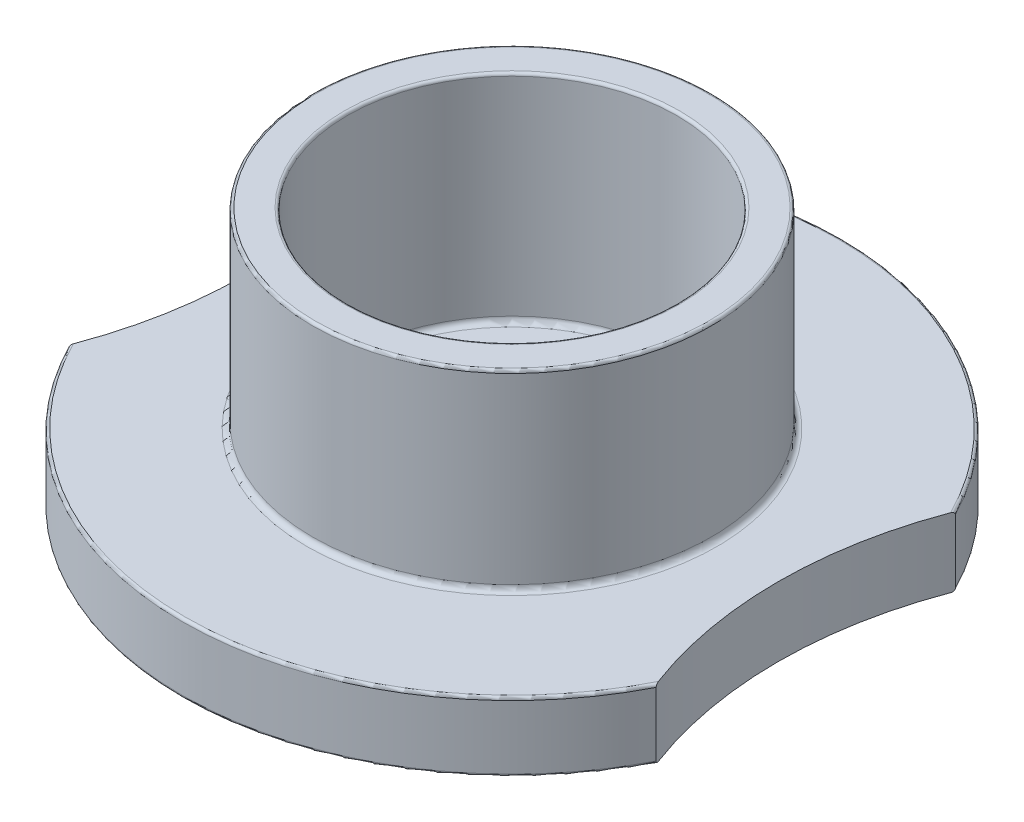
ISO-10303-21;
HEADER;
FILE_DESCRIPTION(('STEP AP214'),'2;1');
FILE_NAME('part.step','',(''),(''),'','','');
FILE_SCHEMA(('AUTOMOTIVE_DESIGN { 1 0 10303 214 1 1 1 1 }'));
ENDSEC;
DATA;
#1=APPLICATION_CONTEXT('core data for automotive mechanical design processes');
#2=APPLICATION_PROTOCOL_DEFINITION('international standard','automotive_design',2000,#1);
#3=PRODUCT_CONTEXT('',#1,'mechanical');
#4=PRODUCT('Part','Part','',(#3));
#5=PRODUCT_RELATED_PRODUCT_CATEGORY('part','',(#4));
#6=PRODUCT_DEFINITION_FORMATION('','',#4);
#7=PRODUCT_DEFINITION_CONTEXT('part definition',#1,'design');
#8=PRODUCT_DEFINITION('design','',#6,#7);
#9=PRODUCT_DEFINITION_SHAPE('','',#8);
#10=(LENGTH_UNIT() NAMED_UNIT(*) SI_UNIT(.MILLI.,.METRE.));
#11=(NAMED_UNIT(*) PLANE_ANGLE_UNIT() SI_UNIT($,.RADIAN.));
#12=(NAMED_UNIT(*) SI_UNIT($,.STERADIAN.) SOLID_ANGLE_UNIT());
#13=UNCERTAINTY_MEASURE_WITH_UNIT(LENGTH_MEASURE(1.E-05),#10,'distance_accuracy_value','');
#14=(GEOMETRIC_REPRESENTATION_CONTEXT(3) GLOBAL_UNCERTAINTY_ASSIGNED_CONTEXT((#13)) GLOBAL_UNIT_ASSIGNED_CONTEXT((#10,
#11,#12)) REPRESENTATION_CONTEXT('',''));
#15=CARTESIAN_POINT('',(0.,0.,0.));
#16=DIRECTION('',(0.,0.,1.));
#17=DIRECTION('',(1.,0.,0.));
#18=AXIS2_PLACEMENT_3D('',#15,#16,#17);
#19=CARTESIAN_POINT('',(0.,-51.2195195195195,0.));
#20=DIRECTION('',(0.,-1.,0.));
#21=DIRECTION('',(0.,0.,-1.));
#22=AXIS2_PLACEMENT_3D('',#19,#20,#21);
#23=CYLINDRICAL_SURFACE('',#22,59.5);
#24=DIRECTION('',(0.,-1.,0.));
#25=VECTOR('',#24,1.);
#26=CARTESIAN_POINT('',(-53.0212221662232,0.0825825825825979,-27.));
#27=LINE('',#26,#25);
#28=CARTESIAN_POINT('',(-53.0212221662232,-11.4174174174174,-27.));
#29=VERTEX_POINT('',#28);
#30=CARTESIAN_POINT('',(-53.0212221662232,-22.9174174174174,-27.));
#31=VERTEX_POINT('',#30);
#32=EDGE_CURVE('E100',#29,#31,#27,.T.);
#33=ORIENTED_EDGE('',*,*,#32,.F.);
#34=CARTESIAN_POINT('',(0.,-11.4174174174174,0.));
#35=DIRECTION('',(0.,1.,0.));
#36=DIRECTION('',(0.,0.,1.));
#37=AXIS2_PLACEMENT_3D('',#34,#35,#36);
#38=CIRCLE('',#37,59.5);
#39=CARTESIAN_POINT('',(53.0212221662232,-11.4174174174174,-27.));
#40=VERTEX_POINT('',#39);
#41=EDGE_CURVE('E113',#29,#40,#38,.F.);
#42=ORIENTED_EDGE('',*,*,#41,.T.);
#43=DIRECTION('',(0.,-1.,0.));
#44=VECTOR('',#43,1.);
#45=CARTESIAN_POINT('',(53.0212221662232,0.0825825825825979,-27.));
#46=LINE('',#45,#44);
#47=CARTESIAN_POINT('',(53.0212221662232,-22.9174174174174,-27.));
#48=VERTEX_POINT('',#47);
#49=EDGE_CURVE('E201',#48,#40,#46,.F.);
#50=ORIENTED_EDGE('',*,*,#49,.F.);
#51=CARTESIAN_POINT('',(0.,-22.9174174174174,0.));
#52=DIRECTION('',(0.,-1.,0.));
#53=DIRECTION('',(0.,0.,-1.));
#54=AXIS2_PLACEMENT_3D('',#51,#52,#53);
#55=CIRCLE('',#54,59.5);
#56=EDGE_CURVE('E116',#48,#31,#55,.F.);
#57=ORIENTED_EDGE('',*,*,#56,.T.);
#58=EDGE_LOOP('',(#33,#42,#50,#57));
#59=FACE_BOUND('',#58,.T.);
#60=ADVANCED_FACE('F30',(#59),#23,.T.);
#61=CARTESIAN_POINT('',(0.,-51.2195195195195,0.));
#62=DIRECTION('',(0.,-1.,0.));
#63=DIRECTION('',(0.,0.,-1.));
#64=AXIS2_PLACEMENT_3D('',#61,#62,#63);
#65=CYLINDRICAL_SURFACE('',#64,29.75);
#66=CARTESIAN_POINT('',(0.,-14.4174174174174,0.));
#67=DIRECTION('',(0.,1.,0.));
#68=DIRECTION('',(0.,0.,1.));
#69=AXIS2_PLACEMENT_3D('',#66,#67,#68);
#70=CIRCLE('',#69,29.75);
#71=CARTESIAN_POINT('',(0.,-14.4174174174174,29.75));
#72=VERTEX_POINT('',#71);
#73=EDGE_CURVE('E228',#72,#72,#70,.F.);
#74=ORIENTED_EDGE('',*,*,#73,.T.);
#75=EDGE_LOOP('',(#74));
#76=FACE_BOUND('',#75,.T.);
#77=CARTESIAN_POINT('',(0.,23.0825825825826,0.));
#78=DIRECTION('',(0.,1.,0.));
#79=DIRECTION('',(0.,0.,1.));
#80=AXIS2_PLACEMENT_3D('',#77,#78,#79);
#81=CIRCLE('',#80,29.75);
#82=CARTESIAN_POINT('',(0.,23.0825825825826,29.75));
#83=VERTEX_POINT('',#82);
#84=EDGE_CURVE('E216',#83,#83,#81,.T.);
#85=ORIENTED_EDGE('',*,*,#84,.T.);
#86=EDGE_LOOP('',(#85));
#87=FACE_BOUND('',#86,.T.);
#88=ADVANCED_FACE('F275',(#76,#87),#65,.F.);
#89=CARTESIAN_POINT('',(29.75,23.5825825825826,0.));
#90=DIRECTION('',(0.,1.,0.));
#91=DIRECTION('',(0.,0.,1.));
#92=AXIS2_PLACEMENT_3D('',#89,#90,#91);
#93=PLANE('',#92);
#94=CARTESIAN_POINT('',(0.,23.5825825825826,0.));
#95=DIRECTION('',(0.,1.,0.));
#96=DIRECTION('',(0.,0.,1.));
#97=AXIS2_PLACEMENT_3D('',#94,#95,#96);
#98=CIRCLE('',#97,30.25);
#99=CARTESIAN_POINT('',(0.,23.5825825825826,30.25));
#100=VERTEX_POINT('',#99);
#101=EDGE_CURVE('E213',#100,#100,#98,.F.);
#102=ORIENTED_EDGE('',*,*,#101,.T.);
#103=EDGE_LOOP('',(#102));
#104=FACE_BOUND('',#103,.T.);
#105=CARTESIAN_POINT('',(0.,23.5825825825826,0.));
#106=DIRECTION('',(0.,1.,0.));
#107=DIRECTION('',(0.,0.,1.));
#108=AXIS2_PLACEMENT_3D('',#105,#106,#107);
#109=CIRCLE('',#108,35.5);
#110=CARTESIAN_POINT('',(0.,23.5825825825826,35.5));
#111=VERTEX_POINT('',#110);
#112=EDGE_CURVE('E210',#111,#111,#109,.T.);
#113=ORIENTED_EDGE('',*,*,#112,.T.);
#114=EDGE_LOOP('',(#113));
#115=FACE_BOUND('',#114,.T.);
#116=ADVANCED_FACE('F281',(#104,#115),#93,.T.);
#117=CARTESIAN_POINT('',(0.,-51.2195195195195,0.));
#118=DIRECTION('',(0.,-1.,0.));
#119=DIRECTION('',(0.,0.,-1.));
#120=AXIS2_PLACEMENT_3D('',#117,#118,#119);
#121=CYLINDRICAL_SURFACE('',#120,36.);
#122=CARTESIAN_POINT('',(0.,-9.9174174174174,0.));
#123=DIRECTION('',(0.,1.,0.));
#124=DIRECTION('',(0.,0.,1.));
#125=AXIS2_PLACEMENT_3D('',#122,#123,#124);
#126=CIRCLE('',#125,36.);
#127=CARTESIAN_POINT('',(0.,-9.9174174174174,36.));
#128=VERTEX_POINT('',#127);
#129=EDGE_CURVE('E225',#128,#128,#126,.T.);
#130=ORIENTED_EDGE('',*,*,#129,.T.);
#131=EDGE_LOOP('',(#130));
#132=FACE_BOUND('',#131,.T.);
#133=CARTESIAN_POINT('',(0.,23.0825825825826,0.));
#134=DIRECTION('',(0.,1.,0.));
#135=DIRECTION('',(0.,0.,1.));
#136=AXIS2_PLACEMENT_3D('',#133,#134,#135);
#137=CIRCLE('',#136,36.);
#138=CARTESIAN_POINT('',(0.,23.0825825825826,36.));
#139=VERTEX_POINT('',#138);
#140=EDGE_CURVE('E219',#139,#139,#137,.F.);
#141=ORIENTED_EDGE('',*,*,#140,.T.);
#142=EDGE_LOOP('',(#141));
#143=FACE_BOUND('',#142,.T.);
#144=ADVANCED_FACE('F294',(#132,#143),#121,.T.);
#145=CARTESIAN_POINT('',(36.,-10.9174174174174,0.));
#146=DIRECTION('',(0.,1.,0.));
#147=DIRECTION('',(0.,0.,1.));
#148=AXIS2_PLACEMENT_3D('',#145,#146,#147);
#149=PLANE('',#148);
#150=CARTESIAN_POINT('',(0.,-10.9174174174174,0.));
#151=DIRECTION('',(0.,1.,0.));
#152=DIRECTION('',(0.,0.,1.));
#153=AXIS2_PLACEMENT_3D('',#150,#151,#152);
#154=CIRCLE('',#153,37.);
#155=CARTESIAN_POINT('',(0.,-10.9174174174174,37.));
#156=VERTEX_POINT('',#155);
#157=EDGE_CURVE('E222',#156,#156,#154,.F.);
#158=ORIENTED_EDGE('',*,*,#157,.T.);
#159=EDGE_LOOP('',(#158));
#160=FACE_BOUND('',#159,.T.);
#161=CARTESIAN_POINT('',(122.992644904367,-10.9174174174174,0.));
#162=DIRECTION('',(0.,1.,0.));
#163=DIRECTION('',(0.,0.,1.));
#164=AXIS2_PLACEMENT_3D('',#161,#162,#163);
#165=CIRCLE('',#164,75.);
#166=CARTESIAN_POINT('',(52.7803541043725,-10.9174174174174,-26.3672945259282));
#167=VERTEX_POINT('',#166);
#168=CARTESIAN_POINT('',(52.7803541043725,-10.9174174174174,26.3672945259282));
#169=VERTEX_POINT('',#168);
#170=EDGE_CURVE('E203',#167,#169,#165,.T.);
#171=ORIENTED_EDGE('',*,*,#170,.F.);
#172=CARTESIAN_POINT('',(0.,-10.9174174174174,0.));
#173=DIRECTION('',(0.,1.,0.));
#174=DIRECTION('',(0.,0.,1.));
#175=AXIS2_PLACEMENT_3D('',#172,#173,#174);
#176=CIRCLE('',#175,59.);
#177=CARTESIAN_POINT('',(-52.7803541043725,-10.9174174174174,-26.3672945259282));
#178=VERTEX_POINT('',#177);
#179=EDGE_CURVE('E411',#167,#178,#176,.T.);
#180=ORIENTED_EDGE('',*,*,#179,.T.);
#181=CARTESIAN_POINT('',(-122.992644904367,-10.9174174174174,0.));
#182=DIRECTION('',(0.,1.,0.));
#183=DIRECTION('',(0.,0.,1.));
#184=AXIS2_PLACEMENT_3D('',#181,#182,#183);
#185=CIRCLE('',#184,75.);
#186=CARTESIAN_POINT('',(-52.7803541043725,-10.9174174174174,26.3672945259282));
#187=VERTEX_POINT('',#186);
#188=EDGE_CURVE('E103',#187,#178,#185,.T.);
#189=ORIENTED_EDGE('',*,*,#188,.F.);
#190=CARTESIAN_POINT('',(0.,-10.9174174174174,0.));
#191=DIRECTION('',(0.,1.,0.));
#192=DIRECTION('',(0.,0.,1.));
#193=AXIS2_PLACEMENT_3D('',#190,#191,#192);
#194=CIRCLE('',#193,59.);
#195=EDGE_CURVE('E408',#187,#169,#194,.T.);
#196=ORIENTED_EDGE('',*,*,#195,.T.);
#197=EDGE_LOOP('',(#171,#180,#189,#196));
#198=FACE_BOUND('',#197,.T.);
#199=ADVANCED_FACE('F288',(#160,#198),#149,.T.);
#200=DIRECTION('',(0.,-1.,0.));
#201=VECTOR('',#200,1.);
#202=CARTESIAN_POINT('',(-53.0212221662232,0.0825825825825979,27.));
#203=LINE('',#202,#201);
#204=CARTESIAN_POINT('',(-53.0212221662232,-22.9174174174174,27.));
#205=VERTEX_POINT('',#204);
#206=CARTESIAN_POINT('',(-53.0212221662232,-11.4174174174174,27.));
#207=VERTEX_POINT('',#206);
#208=EDGE_CURVE('E189',#205,#207,#203,.F.);
#209=ORIENTED_EDGE('',*,*,#208,.F.);
#210=CARTESIAN_POINT('',(0.,-22.9174174174174,0.));
#211=DIRECTION('',(0.,-1.,0.));
#212=DIRECTION('',(0.,0.,-1.));
#213=AXIS2_PLACEMENT_3D('',#210,#211,#212);
#214=CIRCLE('',#213,59.5);
#215=CARTESIAN_POINT('',(53.0212221662232,-22.9174174174174,27.));
#216=VERTEX_POINT('',#215);
#217=EDGE_CURVE('E11',#205,#216,#214,.F.);
#218=ORIENTED_EDGE('',*,*,#217,.T.);
#219=DIRECTION('',(0.,-1.,0.));
#220=VECTOR('',#219,1.);
#221=CARTESIAN_POINT('',(53.0212221662232,0.0825825825825979,27.));
#222=LINE('',#221,#220);
#223=CARTESIAN_POINT('',(53.0212221662232,-11.4174174174174,27.));
#224=VERTEX_POINT('',#223);
#225=EDGE_CURVE('E192',#224,#216,#222,.T.);
#226=ORIENTED_EDGE('',*,*,#225,.F.);
#227=CARTESIAN_POINT('',(0.,-11.4174174174174,0.));
#228=DIRECTION('',(0.,1.,0.));
#229=DIRECTION('',(0.,0.,1.));
#230=AXIS2_PLACEMENT_3D('',#227,#228,#229);
#231=CIRCLE('',#230,59.5);
#232=EDGE_CURVE('E39',#224,#207,#231,.F.);
#233=ORIENTED_EDGE('',*,*,#232,.T.);
#234=EDGE_LOOP('',(#209,#218,#226,#233));
#235=FACE_BOUND('',#234,.T.);
#236=ADVANCED_FACE('F188',(#235),#23,.T.);
#237=CARTESIAN_POINT('',(59.5,-23.4174174174174,0.));
#238=DIRECTION('',(0.,-1.,0.));
#239=DIRECTION('',(0.,0.,-1.));
#240=AXIS2_PLACEMENT_3D('',#237,#238,#239);
#241=PLANE('',#240);
#242=CARTESIAN_POINT('',(0.,-23.4174174174174,0.));
#243=DIRECTION('',(0.,-1.,0.));
#244=DIRECTION('',(0.,0.,-1.));
#245=AXIS2_PLACEMENT_3D('',#242,#243,#244);
#246=CIRCLE('',#245,31.5);
#247=CARTESIAN_POINT('',(0.,-23.4174174174174,-31.5));
#248=VERTEX_POINT('',#247);
#249=EDGE_CURVE('E255',#248,#248,#246,.F.);
#250=ORIENTED_EDGE('',*,*,#249,.T.);
#251=EDGE_LOOP('',(#250));
#252=FACE_BOUND('',#251,.T.);
#253=CARTESIAN_POINT('',(-122.992644904367,-23.4174174174174,0.));
#254=DIRECTION('',(0.,-1.,0.));
#255=DIRECTION('',(0.,0.,1.));
#256=AXIS2_PLACEMENT_3D('',#253,#254,#255);
#257=CIRCLE('',#256,75.);
#258=CARTESIAN_POINT('',(-52.7803541043725,-23.4174174174174,-26.3672945259282));
#259=VERTEX_POINT('',#258);
#260=CARTESIAN_POINT('',(-52.7803541043725,-23.4174174174174,26.3672945259282));
#261=VERTEX_POINT('',#260);
#262=EDGE_CURVE('E194',#259,#261,#257,.T.);
#263=ORIENTED_EDGE('',*,*,#262,.F.);
#264=CARTESIAN_POINT('',(0.,-23.4174174174174,0.));
#265=DIRECTION('',(0.,-1.,0.));
#266=DIRECTION('',(0.,0.,-1.));
#267=AXIS2_PLACEMENT_3D('',#264,#265,#266);
#268=CIRCLE('',#267,59.);
#269=CARTESIAN_POINT('',(52.7803541043725,-23.4174174174174,-26.3672945259282));
#270=VERTEX_POINT('',#269);
#271=EDGE_CURVE('E184',#259,#270,#268,.T.);
#272=ORIENTED_EDGE('',*,*,#271,.T.);
#273=CARTESIAN_POINT('',(122.992644904367,-23.4174174174174,0.));
#274=DIRECTION('',(0.,-1.,0.));
#275=DIRECTION('',(0.,0.,-1.));
#276=AXIS2_PLACEMENT_3D('',#273,#274,#275);
#277=CIRCLE('',#276,75.);
#278=CARTESIAN_POINT('',(52.7803541043725,-23.4174174174174,26.3672945259282));
#279=VERTEX_POINT('',#278);
#280=EDGE_CURVE('E117',#279,#270,#277,.T.);
#281=ORIENTED_EDGE('',*,*,#280,.F.);
#282=CARTESIAN_POINT('',(0.,-23.4174174174174,0.));
#283=DIRECTION('',(0.,-1.,0.));
#284=DIRECTION('',(0.,0.,-1.));
#285=AXIS2_PLACEMENT_3D('',#282,#283,#284);
#286=CIRCLE('',#285,59.);
#287=EDGE_CURVE('E107',#279,#261,#286,.T.);
#288=ORIENTED_EDGE('',*,*,#287,.T.);
#289=EDGE_LOOP('',(#263,#272,#281,#288));
#290=FACE_BOUND('',#289,.T.);
#291=ADVANCED_FACE('F287',(#252,#290),#241,.T.);
#292=CARTESIAN_POINT('',(0.,-51.2195195195195,0.));
#293=DIRECTION('',(0.,-1.,0.));
#294=DIRECTION('',(0.,0.,-1.));
#295=AXIS2_PLACEMENT_3D('',#292,#293,#294);
#296=CYLINDRICAL_SURFACE('',#295,30.5);
#297=CARTESIAN_POINT('',(0.,-24.4174174174174,0.));
#298=DIRECTION('',(0.,-1.,0.));
#299=DIRECTION('',(0.,0.,-1.));
#300=AXIS2_PLACEMENT_3D('',#297,#298,#299);
#301=CIRCLE('',#300,30.5);
#302=CARTESIAN_POINT('',(0.,-24.4174174174174,-30.5));
#303=VERTEX_POINT('',#302);
#304=EDGE_CURVE('E252',#303,#303,#301,.T.);
#305=ORIENTED_EDGE('',*,*,#304,.T.);
#306=EDGE_LOOP('',(#305));
#307=FACE_BOUND('',#306,.T.);
#308=CARTESIAN_POINT('',(0.,-32.4174174174174,0.));
#309=DIRECTION('',(0.,-1.,0.));
#310=DIRECTION('',(0.,0.,-1.));
#311=AXIS2_PLACEMENT_3D('',#308,#309,#310);
#312=CIRCLE('',#311,30.5);
#313=CARTESIAN_POINT('',(0.,-32.4174174174174,-30.5));
#314=VERTEX_POINT('',#313);
#315=EDGE_CURVE('E207',#314,#314,#312,.T.);
#316=ORIENTED_EDGE('',*,*,#315,.F.);
#317=EDGE_LOOP('',(#316));
#318=FACE_BOUND('',#317,.T.);
#319=ADVANCED_FACE('F292',(#307,#318),#296,.T.);
#320=CARTESIAN_POINT('',(0.,-51.2195195195195,0.));
#321=DIRECTION('',(0.,-1.,0.));
#322=DIRECTION('',(0.,0.,-1.));
#323=AXIS2_PLACEMENT_3D('',#320,#321,#322);
#324=CYLINDRICAL_SURFACE('',#323,30.);
#325=CARTESIAN_POINT('',(0.,-32.9174174174174,0.));
#326=DIRECTION('',(0.,-1.,0.));
#327=DIRECTION('',(0.,0.,-1.));
#328=AXIS2_PLACEMENT_3D('',#325,#326,#327);
#329=CIRCLE('',#328,30.);
#330=CARTESIAN_POINT('',(0.,-32.9174174174174,-30.));
#331=VERTEX_POINT('',#330);
#332=EDGE_CURVE('E125',#331,#331,#329,.T.);
#333=ORIENTED_EDGE('',*,*,#332,.T.);
#334=EDGE_LOOP('',(#333));
#335=FACE_BOUND('',#334,.T.);
#336=CARTESIAN_POINT('',(0.,-40.9174174174174,0.));
#337=DIRECTION('',(0.,-1.,0.));
#338=DIRECTION('',(0.,0.,-1.));
#339=AXIS2_PLACEMENT_3D('',#336,#337,#338);
#340=CIRCLE('',#339,30.);
#341=CARTESIAN_POINT('',(0.,-40.9174174174174,-30.));
#342=VERTEX_POINT('',#341);
#343=EDGE_CURVE('E249',#342,#342,#340,.F.);
#344=ORIENTED_EDGE('',*,*,#343,.T.);
#345=EDGE_LOOP('',(#344));
#346=FACE_BOUND('',#345,.T.);
#347=ADVANCED_FACE('F260',(#335,#346),#324,.T.);
#348=CARTESIAN_POINT('',(30.,-41.4174174174174,0.));
#349=DIRECTION('',(0.,-1.,0.));
#350=DIRECTION('',(0.,0.,-1.));
#351=AXIS2_PLACEMENT_3D('',#348,#349,#350);
#352=PLANE('',#351);
#353=CARTESIAN_POINT('',(0.,-41.4174174174174,0.));
#354=DIRECTION('',(0.,-1.,0.));
#355=DIRECTION('',(0.,0.,-1.));
#356=AXIS2_PLACEMENT_3D('',#353,#354,#355);
#357=CIRCLE('',#356,23.5);
#358=CARTESIAN_POINT('',(0.,-41.4174174174174,-23.5));
#359=VERTEX_POINT('',#358);
#360=EDGE_CURVE('E246',#359,#359,#357,.F.);
#361=ORIENTED_EDGE('',*,*,#360,.T.);
#362=EDGE_LOOP('',(#361));
#363=FACE_BOUND('',#362,.T.);
#364=CARTESIAN_POINT('',(0.,-41.4174174174174,0.));
#365=DIRECTION('',(0.,-1.,0.));
#366=DIRECTION('',(0.,0.,-1.));
#367=AXIS2_PLACEMENT_3D('',#364,#365,#366);
#368=CIRCLE('',#367,29.5);
#369=CARTESIAN_POINT('',(0.,-41.4174174174174,-29.5));
#370=VERTEX_POINT('',#369);
#371=EDGE_CURVE('E243',#370,#370,#368,.T.);
#372=ORIENTED_EDGE('',*,*,#371,.T.);
#373=EDGE_LOOP('',(#372));
#374=FACE_BOUND('',#373,.T.);
#375=ADVANCED_FACE('F338',(#363,#374),#352,.T.);
#376=CARTESIAN_POINT('',(0.,-51.2195195195195,0.));
#377=DIRECTION('',(0.,-1.,0.));
#378=DIRECTION('',(0.,0.,-1.));
#379=AXIS2_PLACEMENT_3D('',#376,#377,#378);
#380=CYLINDRICAL_SURFACE('',#379,23.);
#381=CARTESIAN_POINT('',(0.,-40.9174174174174,0.));
#382=DIRECTION('',(0.,-1.,0.));
#383=DIRECTION('',(0.,0.,-1.));
#384=AXIS2_PLACEMENT_3D('',#381,#382,#383);
#385=CIRCLE('',#384,23.);
#386=CARTESIAN_POINT('',(0.,-40.9174174174174,-23.));
#387=VERTEX_POINT('',#386);
#388=EDGE_CURVE('E240',#387,#387,#385,.T.);
#389=ORIENTED_EDGE('',*,*,#388,.T.);
#390=EDGE_LOOP('',(#389));
#391=FACE_BOUND('',#390,.T.);
#392=CARTESIAN_POINT('',(0.,-15.994767686607,0.));
#393=DIRECTION('',(0.,1.,0.));
#394=DIRECTION('',(0.,0.,1.));
#395=AXIS2_PLACEMENT_3D('',#392,#393,#394);
#396=CIRCLE('',#395,23.);
#397=CARTESIAN_POINT('',(0.,-15.994767686607,23.));
#398=VERTEX_POINT('',#397);
#399=EDGE_CURVE('E237',#398,#398,#396,.T.);
#400=ORIENTED_EDGE('',*,*,#399,.T.);
#401=EDGE_LOOP('',(#400));
#402=FACE_BOUND('',#401,.T.);
#403=ADVANCED_FACE('F340',(#391,#402),#380,.F.);
#404=CARTESIAN_POINT('',(23.,-15.4174174174174,0.));
#405=DIRECTION('',(0.,1.,0.));
#406=DIRECTION('',(0.,0.,1.));
#407=AXIS2_PLACEMENT_3D('',#404,#405,#406);
#408=PLANE('',#407);
#409=CARTESIAN_POINT('',(0.,-15.4174174174174,0.));
#410=DIRECTION('',(0.,1.,0.));
#411=DIRECTION('',(0.,0.,1.));
#412=AXIS2_PLACEMENT_3D('',#409,#410,#411);
#413=CIRCLE('',#412,24.);
#414=CARTESIAN_POINT('',(0.,-15.4174174174174,24.));
#415=VERTEX_POINT('',#414);
#416=EDGE_CURVE('E234',#415,#415,#413,.F.);
#417=ORIENTED_EDGE('',*,*,#416,.T.);
#418=EDGE_LOOP('',(#417));
#419=FACE_BOUND('',#418,.T.);
#420=CARTESIAN_POINT('',(0.,-15.4174174174174,0.));
#421=DIRECTION('',(0.,1.,0.));
#422=DIRECTION('',(0.,0.,1.));
#423=AXIS2_PLACEMENT_3D('',#420,#421,#422);
#424=CIRCLE('',#423,28.75);
#425=CARTESIAN_POINT('',(0.,-15.4174174174174,28.75));
#426=VERTEX_POINT('',#425);
#427=EDGE_CURVE('E231',#426,#426,#424,.T.);
#428=ORIENTED_EDGE('',*,*,#427,.T.);
#429=EDGE_LOOP('',(#428));
#430=FACE_BOUND('',#429,.T.);
#431=ADVANCED_FACE('F142',(#419,#430),#408,.T.);
#432=CARTESIAN_POINT('',(122.992644904367,23.5825825825826,0.));
#433=DIRECTION('',(0.,-1.,0.));
#434=DIRECTION('',(0.,0.,-1.));
#435=AXIS2_PLACEMENT_3D('',#432,#433,#434);
#436=CYLINDRICAL_SURFACE('',#435,75.);
#437=ORIENTED_EDGE('',*,*,#49,.T.);
#438=CARTESIAN_POINT('',(53.0212221662232,-11.4174174174174,-27.));
#439=CARTESIAN_POINT('',(53.0212402425876,-11.3943250363278,-27.0000459523795));
#440=CARTESIAN_POINT('',(53.0204495107268,-11.3712815245362,-26.9979976572714));
#441=CARTESIAN_POINT('',(53.0174049755558,-11.3261259043023,-26.9901060935333));
#442=CARTESIAN_POINT('',(53.0151622662236,-11.3040080762288,-26.984291600753));
#443=CARTESIAN_POINT('',(53.0093706137524,-11.2612161321804,-26.9692673175416));
#444=CARTESIAN_POINT('',(53.0058245648417,-11.2405389372091,-26.9600650500139));
#445=CARTESIAN_POINT('',(52.9976323266928,-11.2009291094981,-26.9387888632914));
#446=CARTESIAN_POINT('',(52.9929840040464,-11.181999959999,-26.9267093751428));
#447=CARTESIAN_POINT('',(52.9809864063638,-11.1397557483227,-26.8955022484262));
#448=CARTESIAN_POINT('',(52.9732641682691,-11.1172702926153,-26.8753950129031));
#449=CARTESIAN_POINT('',(52.9566414231667,-11.0760883821598,-26.8320472251523));
#450=CARTESIAN_POINT('',(52.9477390667744,-11.0573979935765,-26.8088017538636));
#451=CARTESIAN_POINT('',(52.9260483775297,-11.0181896513749,-26.7520699286576));
#452=CARTESIAN_POINT('',(52.9129441274602,-10.9990880128667,-26.7177277947695));
#453=CARTESIAN_POINT('',(52.8858620645428,-10.967027418895,-26.6465843549584));
#454=CARTESIAN_POINT('',(52.8718825218661,-10.9540810914104,-26.6097781687519));
#455=CARTESIAN_POINT('',(52.8449643150789,-10.9350487314585,-26.5387300397853));
#456=CARTESIAN_POINT('',(52.8320694842334,-10.9283872968758,-26.5046219163076));
#457=CARTESIAN_POINT('',(52.8062224116793,-10.9195947345823,-26.436101318381));
#458=CARTESIAN_POINT('',(52.7932710940636,-10.9174343207532,-26.4016922835961));
#459=CARTESIAN_POINT('',(52.7803541043725,-10.9174174174174,-26.3672945259282));
#460=B_SPLINE_CURVE_WITH_KNOTS('',3,(#438,#439,#440,#441,#442,#443,#444,#445,#446,#447,#448,
#449,#450,#451,#452,#453,#454,#455,#456,#457,#458,#459),.UNSPECIFIED.,.F.,.F.,(4,2,2,2,2,2,2,2,
2,2,4),(0.,0.0690955293968667,0.137669260373887,0.206091625871667,0.274647516915946,
0.367548769207161,0.460597368885717,0.584210193060348,0.708075533398436,0.819000570246761,
0.929201584554941),.UNSPECIFIED.);
#461=EDGE_CURVE('E120',#40,#167,#460,.T.);
#462=ORIENTED_EDGE('',*,*,#461,.T.);
#463=ORIENTED_EDGE('',*,*,#170,.T.);
#464=CARTESIAN_POINT('',(52.7803541043725,-10.9174174174174,26.3672945259282));
#465=CARTESIAN_POINT('',(52.795125730955,-10.9174440604317,26.4066323745432));
#466=CARTESIAN_POINT('',(52.8099532657778,-10.9202667852223,26.4460124637363));
#467=CARTESIAN_POINT('',(52.8394948155523,-10.9318001296821,26.5242766245786));
#468=CARTESIAN_POINT('',(52.8542071648714,-10.9405544040657,26.5631548250976));
#469=CARTESIAN_POINT('',(52.8820696340876,-10.9634380976337,26.6366041591536));
#470=CARTESIAN_POINT('',(52.8952575675429,-10.9771558739389,26.6712875285323));
#471=CARTESIAN_POINT('',(52.9207274220046,-11.0102825655208,26.7381309906759));
#472=CARTESIAN_POINT('',(52.9330116453425,-11.0296763442282,26.7702975098019));
#473=CARTESIAN_POINT('',(52.9532626239307,-11.0688924882052,26.823227347751));
#474=CARTESIAN_POINT('',(52.9615432294872,-11.0874081415043,26.84483682218));
#475=CARTESIAN_POINT('',(52.9769695856324,-11.1278910654995,26.8850454939543));
#476=CARTESIAN_POINT('',(52.9841164744669,-11.1498548296477,26.9036477109337));
#477=CARTESIAN_POINT('',(52.9956478860242,-11.1925430531069,26.933633559391));
#478=CARTESIAN_POINT('',(53.0002993002396,-11.21270175766,26.9457173316027));
#479=CARTESIAN_POINT('',(53.0083459190305,-11.2548601489758,26.9666093619281));
#480=CARTESIAN_POINT('',(53.0117437391366,-11.2768558838851,26.9754244401251));
#481=CARTESIAN_POINT('',(53.0166263018579,-11.3184759780354,26.9880873952559));
#482=CARTESIAN_POINT('',(53.0183332499775,-11.3378985624749,26.9925124092168));
#483=CARTESIAN_POINT('',(53.020639113092,-11.3773418440354,26.998489002328));
#484=CARTESIAN_POINT('',(53.0212324022654,-11.3973650615556,27.0000259922153));
#485=CARTESIAN_POINT('',(53.0212221662232,-11.4174174174174,27.));
#486=B_SPLINE_CURVE_WITH_KNOTS('',3,(#464,#465,#466,#467,#468,#469,#470,#471,#472,#473,#474,
#475,#476,#477,#478,#479,#480,#481,#482,#483,#484,#485),.UNSPECIFIED.,.F.,.F.,(4,2,2,2,2,2,2,2,
2,2,4),(0.,0.126064126162327,0.253066277774607,0.371323056036447,0.489267300834743,
0.577871970182549,0.666387110046154,0.737980988409614,0.809424635227269,0.869165060671508,
0.929206470361619),.UNSPECIFIED.);
#487=EDGE_CURVE('E121',#169,#224,#486,.T.);
#488=ORIENTED_EDGE('',*,*,#487,.T.);
#489=ORIENTED_EDGE('',*,*,#225,.T.);
#490=CARTESIAN_POINT('',(53.0212221662232,-22.9174174174174,27.));
#491=CARTESIAN_POINT('',(53.0212402425876,-22.9405097985071,27.0000459523795));
#492=CARTESIAN_POINT('',(53.0204495107268,-22.9635533102986,26.9979976572714));
#493=CARTESIAN_POINT('',(53.0174049755558,-23.0087089305325,26.9901060935333));
#494=CARTESIAN_POINT('',(53.0151622662236,-23.0308267586061,26.984291600753));
#495=CARTESIAN_POINT('',(53.0093706137524,-23.0736187026544,26.9692673175416));
#496=CARTESIAN_POINT('',(53.0058245648417,-23.0942958976257,26.9600650500139));
#497=CARTESIAN_POINT('',(52.9976323266928,-23.1339057253367,26.9387888632914));
#498=CARTESIAN_POINT('',(52.9929840040464,-23.1528348748358,26.9267093751428));
#499=CARTESIAN_POINT('',(52.9809864063638,-23.1950790865121,26.8955022484262));
#500=CARTESIAN_POINT('',(52.9732641682691,-23.2175645422195,26.8753950129031));
#501=CARTESIAN_POINT('',(52.9566414231667,-23.258746452675,26.8320472251523));
#502=CARTESIAN_POINT('',(52.9477390667744,-23.2774368412583,26.8088017538637));
#503=CARTESIAN_POINT('',(52.9260483775297,-23.3166451834599,26.7520699286576));
#504=CARTESIAN_POINT('',(52.9129441274602,-23.3357468219681,26.7177277947695));
#505=CARTESIAN_POINT('',(52.8858620645428,-23.3678074159398,26.6465843549584));
#506=CARTESIAN_POINT('',(52.8718825218661,-23.3807537434244,26.6097781687518));
#507=CARTESIAN_POINT('',(52.8449643150789,-23.3997861033764,26.5387300397853));
#508=CARTESIAN_POINT('',(52.8320694842334,-23.406447537959,26.5046219163076));
#509=CARTESIAN_POINT('',(52.8062224116793,-23.4152401002525,26.436101318381));
#510=CARTESIAN_POINT('',(52.7932710940636,-23.4174005140816,26.4016922835961));
#511=CARTESIAN_POINT('',(52.7803541043725,-23.4174174174174,26.3672945259282));
#512=B_SPLINE_CURVE_WITH_KNOTS('',3,(#490,#491,#492,#493,#494,#495,#496,#497,#498,#499,#500,
#501,#502,#503,#504,#505,#506,#507,#508,#509,#510,#511),.UNSPECIFIED.,.F.,.F.,(4,2,2,2,2,2,2,2,
2,2,4),(0.,0.0690955293968684,0.137669260373887,0.206091625871667,0.274647516915943,
0.367548769207157,0.460597368885714,0.584210193060357,0.708075533398454,0.819000570246766,
0.92920158455494),.UNSPECIFIED.);
#513=EDGE_CURVE('E123',#216,#279,#512,.T.);
#514=ORIENTED_EDGE('',*,*,#513,.T.);
#515=ORIENTED_EDGE('',*,*,#280,.T.);
#516=CARTESIAN_POINT('',(52.7803541043725,-23.4174174174174,-26.3672945259282));
#517=CARTESIAN_POINT('',(52.795125730955,-23.4173907744031,-26.4066323745432));
#518=CARTESIAN_POINT('',(52.8099532657778,-23.4145680496125,-26.4460124637363));
#519=CARTESIAN_POINT('',(52.8394948155523,-23.4030347051527,-26.5242766245786));
#520=CARTESIAN_POINT('',(52.8542071648714,-23.3942804307691,-26.5631548250976));
#521=CARTESIAN_POINT('',(52.8820696340876,-23.3713967372011,-26.6366041591536));
#522=CARTESIAN_POINT('',(52.8952575675429,-23.3576789608959,-26.6712875285323));
#523=CARTESIAN_POINT('',(52.9207274220046,-23.324552269314,-26.7381309906759));
#524=CARTESIAN_POINT('',(52.9330116453425,-23.3051584906066,-26.7702975098019));
#525=CARTESIAN_POINT('',(52.9532626239307,-23.2659423466296,-26.823227347751));
#526=CARTESIAN_POINT('',(52.9615432294872,-23.2474266933305,-26.84483682218));
#527=CARTESIAN_POINT('',(52.9769695856324,-23.2069437693353,-26.8850454939543));
#528=CARTESIAN_POINT('',(52.9841164744669,-23.1849800051871,-26.9036477109337));
#529=CARTESIAN_POINT('',(52.9956478860242,-23.1422917817279,-26.933633559391));
#530=CARTESIAN_POINT('',(53.0002993002396,-23.1221330771748,-26.9457173316027));
#531=CARTESIAN_POINT('',(53.0083459190305,-23.0799746858591,-26.9666093619281));
#532=CARTESIAN_POINT('',(53.0117437391366,-23.0579789509497,-26.9754244401251));
#533=CARTESIAN_POINT('',(53.0166263018578,-23.0163588567994,-26.9880873952559));
#534=CARTESIAN_POINT('',(53.0183332499775,-22.9969362723599,-26.9925124092168));
#535=CARTESIAN_POINT('',(53.020639113092,-22.9574929907994,-26.9984890023281));
#536=CARTESIAN_POINT('',(53.0212324022654,-22.9374697732792,-27.0000259922153));
#537=CARTESIAN_POINT('',(53.0212221662232,-22.9174174174174,-27.));
#538=B_SPLINE_CURVE_WITH_KNOTS('',3,(#516,#517,#518,#519,#520,#521,#522,#523,#524,#525,#526,
#527,#528,#529,#530,#531,#532,#533,#534,#535,#536,#537),.UNSPECIFIED.,.F.,.F.,(4,2,2,2,2,2,2,2,
2,2,4),(0.,0.126064126162327,0.253066277774607,0.371323056036444,0.489267300834743,
0.577871970182553,0.666387110046149,0.737980988409606,0.809424635227267,0.869165060671512,
0.929206470361618),.UNSPECIFIED.);
#539=EDGE_CURVE('E150',#270,#48,#538,.T.);
#540=ORIENTED_EDGE('',*,*,#539,.T.);
#541=EDGE_LOOP('',(#437,#462,#463,#488,#489,#514,#515,#540));
#542=FACE_BOUND('',#541,.T.);
#543=ADVANCED_FACE('F137',(#542),#436,.F.);
#544=CARTESIAN_POINT('',(-122.992644904367,23.5825825825826,0.));
#545=DIRECTION('',(0.,-1.,0.));
#546=DIRECTION('',(0.,0.,-1.));
#547=AXIS2_PLACEMENT_3D('',#544,#545,#546);
#548=CYLINDRICAL_SURFACE('',#547,75.);
#549=ORIENTED_EDGE('',*,*,#188,.T.);
#550=CARTESIAN_POINT('',(-52.7803541043725,-10.9174174174174,-26.3672945259282));
#551=CARTESIAN_POINT('',(-52.795125730955,-10.9174440604317,-26.4066323745432));
#552=CARTESIAN_POINT('',(-52.8099532657778,-10.9202667852223,-26.4460124637363));
#553=CARTESIAN_POINT('',(-52.8394948155523,-10.9318001296821,-26.5242766245786));
#554=CARTESIAN_POINT('',(-52.8542071648714,-10.9405544040657,-26.5631548250976));
#555=CARTESIAN_POINT('',(-52.8820696340876,-10.9634380976337,-26.6366041591536));
#556=CARTESIAN_POINT('',(-52.8952575675429,-10.9771558739389,-26.6712875285323));
#557=CARTESIAN_POINT('',(-52.9207274220046,-11.0102825655208,-26.7381309906759));
#558=CARTESIAN_POINT('',(-52.9330116453425,-11.0296763442282,-26.7702975098019));
#559=CARTESIAN_POINT('',(-52.9532626239307,-11.0688924882052,-26.823227347751));
#560=CARTESIAN_POINT('',(-52.9615432294872,-11.0874081415043,-26.84483682218));
#561=CARTESIAN_POINT('',(-52.9769695856324,-11.1278910654995,-26.8850454939543));
#562=CARTESIAN_POINT('',(-52.9841164744669,-11.1498548296477,-26.9036477109337));
#563=CARTESIAN_POINT('',(-52.9956478860242,-11.1925430531069,-26.933633559391));
#564=CARTESIAN_POINT('',(-53.0002993002396,-11.21270175766,-26.9457173316027));
#565=CARTESIAN_POINT('',(-53.0083459190305,-11.2548601489758,-26.9666093619281));
#566=CARTESIAN_POINT('',(-53.0117437391366,-11.2768558838851,-26.9754244401251));
#567=CARTESIAN_POINT('',(-53.0166263018579,-11.3184759780354,-26.9880873952559));
#568=CARTESIAN_POINT('',(-53.0183332499775,-11.3378985624749,-26.9925124092168));
#569=CARTESIAN_POINT('',(-53.020639113092,-11.3773418440354,-26.998489002328));
#570=CARTESIAN_POINT('',(-53.0212324022654,-11.3973650615556,-27.0000259922153));
#571=CARTESIAN_POINT('',(-53.0212221662232,-11.4174174174174,-27.));
#572=B_SPLINE_CURVE_WITH_KNOTS('',3,(#550,#551,#552,#553,#554,#555,#556,#557,#558,#559,#560,
#561,#562,#563,#564,#565,#566,#567,#568,#569,#570,#571),.UNSPECIFIED.,.F.,.F.,(4,2,2,2,2,2,2,2,
2,2,4),(0.,0.126064126162327,0.253066277774607,0.371323056036447,0.489267300834743,
0.577871970182549,0.666387110046154,0.737980988409614,0.809424635227269,0.869165060671508,
0.929206470361619),.UNSPECIFIED.);
#573=EDGE_CURVE('E97',#178,#29,#572,.T.);
#574=ORIENTED_EDGE('',*,*,#573,.T.);
#575=ORIENTED_EDGE('',*,*,#32,.T.);
#576=CARTESIAN_POINT('',(-53.0212221662232,-22.9174174174174,-27.));
#577=CARTESIAN_POINT('',(-53.0212402425876,-22.9405097985071,-27.0000459523795));
#578=CARTESIAN_POINT('',(-53.0204495107268,-22.9635533102986,-26.9979976572714));
#579=CARTESIAN_POINT('',(-53.0174049755558,-23.0087089305325,-26.9901060935333));
#580=CARTESIAN_POINT('',(-53.0151622662236,-23.0308267586061,-26.984291600753));
#581=CARTESIAN_POINT('',(-53.0093706137524,-23.0736187026544,-26.9692673175416));
#582=CARTESIAN_POINT('',(-53.0058245648417,-23.0942958976257,-26.9600650500139));
#583=CARTESIAN_POINT('',(-52.9976323266928,-23.1339057253367,-26.9387888632914));
#584=CARTESIAN_POINT('',(-52.9929840040464,-23.1528348748358,-26.9267093751428));
#585=CARTESIAN_POINT('',(-52.9809864063638,-23.1950790865121,-26.8955022484262));
#586=CARTESIAN_POINT('',(-52.9732641682691,-23.2175645422195,-26.8753950129031));
#587=CARTESIAN_POINT('',(-52.9566414231667,-23.258746452675,-26.8320472251523));
#588=CARTESIAN_POINT('',(-52.9477390667744,-23.2774368412583,-26.8088017538637));
#589=CARTESIAN_POINT('',(-52.9260483775297,-23.3166451834599,-26.7520699286576));
#590=CARTESIAN_POINT('',(-52.9129441274602,-23.3357468219681,-26.7177277947695));
#591=CARTESIAN_POINT('',(-52.8858620645428,-23.3678074159398,-26.6465843549584));
#592=CARTESIAN_POINT('',(-52.8718825218661,-23.3807537434244,-26.6097781687518));
#593=CARTESIAN_POINT('',(-52.8449643150789,-23.3997861033764,-26.5387300397853));
#594=CARTESIAN_POINT('',(-52.8320694842334,-23.406447537959,-26.5046219163076));
#595=CARTESIAN_POINT('',(-52.8062224116793,-23.4152401002525,-26.436101318381));
#596=CARTESIAN_POINT('',(-52.7932710940636,-23.4174005140816,-26.4016922835961));
#597=CARTESIAN_POINT('',(-52.7803541043725,-23.4174174174174,-26.3672945259282));
#598=B_SPLINE_CURVE_WITH_KNOTS('',3,(#576,#577,#578,#579,#580,#581,#582,#583,#584,#585,#586,
#587,#588,#589,#590,#591,#592,#593,#594,#595,#596,#597),.UNSPECIFIED.,.F.,.F.,(4,2,2,2,2,2,2,2,
2,2,4),(0.,0.0690955293968684,0.137669260373887,0.206091625871667,0.274647516915943,
0.367548769207157,0.460597368885714,0.584210193060357,0.708075533398454,0.819000570246766,
0.92920158455494),.UNSPECIFIED.);
#599=EDGE_CURVE('E108',#31,#259,#598,.T.);
#600=ORIENTED_EDGE('',*,*,#599,.T.);
#601=ORIENTED_EDGE('',*,*,#262,.T.);
#602=CARTESIAN_POINT('',(-52.7803541043725,-23.4174174174174,26.3672945259282));
#603=CARTESIAN_POINT('',(-52.795125730955,-23.4173907744031,26.4066323745432));
#604=CARTESIAN_POINT('',(-52.8099532657778,-23.4145680496125,26.4460124637363));
#605=CARTESIAN_POINT('',(-52.8394948155523,-23.4030347051527,26.5242766245786));
#606=CARTESIAN_POINT('',(-52.8542071648714,-23.3942804307691,26.5631548250976));
#607=CARTESIAN_POINT('',(-52.8820696340876,-23.3713967372011,26.6366041591536));
#608=CARTESIAN_POINT('',(-52.8952575675429,-23.3576789608959,26.6712875285323));
#609=CARTESIAN_POINT('',(-52.9207274220046,-23.324552269314,26.7381309906759));
#610=CARTESIAN_POINT('',(-52.9330116453425,-23.3051584906066,26.7702975098019));
#611=CARTESIAN_POINT('',(-52.9532626239307,-23.2659423466296,26.823227347751));
#612=CARTESIAN_POINT('',(-52.9615432294872,-23.2474266933305,26.84483682218));
#613=CARTESIAN_POINT('',(-52.9769695856324,-23.2069437693353,26.8850454939543));
#614=CARTESIAN_POINT('',(-52.9841164744669,-23.1849800051871,26.9036477109337));
#615=CARTESIAN_POINT('',(-52.9956478860242,-23.1422917817279,26.933633559391));
#616=CARTESIAN_POINT('',(-53.0002993002396,-23.1221330771748,26.9457173316027));
#617=CARTESIAN_POINT('',(-53.0083459190305,-23.0799746858591,26.9666093619281));
#618=CARTESIAN_POINT('',(-53.0117437391366,-23.0579789509497,26.9754244401251));
#619=CARTESIAN_POINT('',(-53.0166263018578,-23.0163588567994,26.9880873952559));
#620=CARTESIAN_POINT('',(-53.0183332499775,-22.9969362723599,26.9925124092168));
#621=CARTESIAN_POINT('',(-53.020639113092,-22.9574929907994,26.9984890023281));
#622=CARTESIAN_POINT('',(-53.0212324022654,-22.9374697732792,27.0000259922153));
#623=CARTESIAN_POINT('',(-53.0212221662232,-22.9174174174174,27.));
#624=B_SPLINE_CURVE_WITH_KNOTS('',3,(#602,#603,#604,#605,#606,#607,#608,#609,#610,#611,#612,
#613,#614,#615,#616,#617,#618,#619,#620,#621,#622,#623),.UNSPECIFIED.,.F.,.F.,(4,2,2,2,2,2,2,2,
2,2,4),(0.,0.126064126162327,0.253066277774607,0.371323056036444,0.489267300834743,
0.577871970182553,0.666387110046149,0.737980988409606,0.809424635227267,0.869165060671512,
0.929206470361618),.UNSPECIFIED.);
#625=EDGE_CURVE('E54',#261,#205,#624,.T.);
#626=ORIENTED_EDGE('',*,*,#625,.T.);
#627=ORIENTED_EDGE('',*,*,#208,.T.);
#628=CARTESIAN_POINT('',(-53.0212221662232,-11.4174174174174,27.));
#629=CARTESIAN_POINT('',(-53.0212402425876,-11.3943250363278,27.0000459523795));
#630=CARTESIAN_POINT('',(-53.0204495107268,-11.3712815245362,26.9979976572714));
#631=CARTESIAN_POINT('',(-53.0174049755558,-11.3261259043023,26.9901060935333));
#632=CARTESIAN_POINT('',(-53.0151622662236,-11.3040080762288,26.984291600753));
#633=CARTESIAN_POINT('',(-53.0093706137524,-11.2612161321804,26.9692673175416));
#634=CARTESIAN_POINT('',(-53.0058245648417,-11.2405389372091,26.9600650500139));
#635=CARTESIAN_POINT('',(-52.9976323266928,-11.2009291094981,26.9387888632914));
#636=CARTESIAN_POINT('',(-52.9929840040464,-11.181999959999,26.9267093751428));
#637=CARTESIAN_POINT('',(-52.9809864063638,-11.1397557483227,26.8955022484262));
#638=CARTESIAN_POINT('',(-52.9732641682691,-11.1172702926153,26.8753950129031));
#639=CARTESIAN_POINT('',(-52.9566414231667,-11.0760883821598,26.8320472251523));
#640=CARTESIAN_POINT('',(-52.9477390667744,-11.0573979935765,26.8088017538636));
#641=CARTESIAN_POINT('',(-52.9260483775297,-11.0181896513749,26.7520699286576));
#642=CARTESIAN_POINT('',(-52.9129441274602,-10.9990880128667,26.7177277947695));
#643=CARTESIAN_POINT('',(-52.8858620645428,-10.967027418895,26.6465843549584));
#644=CARTESIAN_POINT('',(-52.8718825218661,-10.9540810914104,26.6097781687519));
#645=CARTESIAN_POINT('',(-52.8449643150789,-10.9350487314585,26.5387300397853));
#646=CARTESIAN_POINT('',(-52.8320694842334,-10.9283872968758,26.5046219163076));
#647=CARTESIAN_POINT('',(-52.8062224116793,-10.9195947345823,26.436101318381));
#648=CARTESIAN_POINT('',(-52.7932710940636,-10.9174343207532,26.4016922835961));
#649=CARTESIAN_POINT('',(-52.7803541043725,-10.9174174174174,26.3672945259282));
#650=B_SPLINE_CURVE_WITH_KNOTS('',3,(#628,#629,#630,#631,#632,#633,#634,#635,#636,#637,#638,
#639,#640,#641,#642,#643,#644,#645,#646,#647,#648,#649),.UNSPECIFIED.,.F.,.F.,(4,2,2,2,2,2,2,2,
2,2,4),(0.,0.0690955293968667,0.137669260373887,0.206091625871667,0.274647516915946,
0.367548769207161,0.460597368885717,0.584210193060348,0.708075533398436,0.819000570246761,
0.929201584554941),.UNSPECIFIED.);
#651=EDGE_CURVE('E46',#207,#187,#650,.T.);
#652=ORIENTED_EDGE('',*,*,#651,.T.);
#653=EDGE_LOOP('',(#549,#574,#575,#600,#601,#626,#627,#652));
#654=FACE_BOUND('',#653,.T.);
#655=ADVANCED_FACE('F99',(#654),#548,.F.);
#656=CARTESIAN_POINT('',(0.,23.0825825825826,0.));
#657=DIRECTION('',(0.,1.,0.));
#658=DIRECTION('',(0.,0.,1.));
#659=AXIS2_PLACEMENT_3D('',#656,#657,#658);
#660=TOROIDAL_SURFACE('',#659,30.25,0.5);
#661=ORIENTED_EDGE('',*,*,#84,.F.);
#662=EDGE_LOOP('',(#661));
#663=FACE_BOUND('',#662,.T.);
#664=ORIENTED_EDGE('',*,*,#101,.F.);
#665=EDGE_LOOP('',(#664));
#666=FACE_BOUND('',#665,.T.);
#667=ADVANCED_FACE('F306',(#663,#666),#660,.T.);
#668=CARTESIAN_POINT('',(0.,23.0825825825826,0.));
#669=DIRECTION('',(0.,1.,0.));
#670=DIRECTION('',(0.,0.,1.));
#671=AXIS2_PLACEMENT_3D('',#668,#669,#670);
#672=TOROIDAL_SURFACE('',#671,35.5,0.5);
#673=ORIENTED_EDGE('',*,*,#112,.F.);
#674=EDGE_LOOP('',(#673));
#675=FACE_BOUND('',#674,.T.);
#676=ORIENTED_EDGE('',*,*,#140,.F.);
#677=EDGE_LOOP('',(#676));
#678=FACE_BOUND('',#677,.T.);
#679=ADVANCED_FACE('F309',(#675,#678),#672,.T.);
#680=CARTESIAN_POINT('',(0.,-9.9174174174174,0.));
#681=DIRECTION('',(0.,1.,0.));
#682=DIRECTION('',(0.,0.,1.));
#683=AXIS2_PLACEMENT_3D('',#680,#681,#682);
#684=TOROIDAL_SURFACE('',#683,37.,1.);
#685=ORIENTED_EDGE('',*,*,#129,.F.);
#686=EDGE_LOOP('',(#685));
#687=FACE_BOUND('',#686,.T.);
#688=ORIENTED_EDGE('',*,*,#157,.F.);
#689=EDGE_LOOP('',(#688));
#690=FACE_BOUND('',#689,.T.);
#691=ADVANCED_FACE('F313',(#687,#690),#684,.F.);
#692=CARTESIAN_POINT('',(0.,-14.4174174174174,0.));
#693=DIRECTION('',(0.,1.,0.));
#694=DIRECTION('',(0.,0.,1.));
#695=AXIS2_PLACEMENT_3D('',#692,#693,#694);
#696=TOROIDAL_SURFACE('',#695,28.75,1.);
#697=ORIENTED_EDGE('',*,*,#427,.F.);
#698=EDGE_LOOP('',(#697));
#699=FACE_BOUND('',#698,.T.);
#700=ORIENTED_EDGE('',*,*,#73,.F.);
#701=EDGE_LOOP('',(#700));
#702=FACE_BOUND('',#701,.T.);
#703=ADVANCED_FACE('F317',(#699,#702),#696,.F.);
#704=CARTESIAN_POINT('',(0.,-15.4174174174174,0.));
#705=DIRECTION('',(0.,1.,0.));
#706=DIRECTION('',(0.,0.,1.));
#707=AXIS2_PLACEMENT_3D('',#704,#705,#706);
#708=CONICAL_SURFACE('',#707,24.,1.04719755119659);
#709=ORIENTED_EDGE('',*,*,#399,.F.);
#710=EDGE_LOOP('',(#709));
#711=FACE_BOUND('',#710,.T.);
#712=ORIENTED_EDGE('',*,*,#416,.F.);
#713=EDGE_LOOP('',(#712));
#714=FACE_BOUND('',#713,.T.);
#715=ADVANCED_FACE('F321',(#711,#714),#708,.F.);
#716=CARTESIAN_POINT('',(0.,-40.9174174174174,0.));
#717=DIRECTION('',(0.,-1.,0.));
#718=DIRECTION('',(0.,0.,-1.));
#719=AXIS2_PLACEMENT_3D('',#716,#717,#718);
#720=TOROIDAL_SURFACE('',#719,23.5,0.5);
#721=ORIENTED_EDGE('',*,*,#360,.F.);
#722=EDGE_LOOP('',(#721));
#723=FACE_BOUND('',#722,.T.);
#724=ORIENTED_EDGE('',*,*,#388,.F.);
#725=EDGE_LOOP('',(#724));
#726=FACE_BOUND('',#725,.T.);
#727=ADVANCED_FACE('F325',(#723,#726),#720,.T.);
#728=CARTESIAN_POINT('',(0.,-40.9174174174174,0.));
#729=DIRECTION('',(0.,-1.,0.));
#730=DIRECTION('',(0.,0.,-1.));
#731=AXIS2_PLACEMENT_3D('',#728,#729,#730);
#732=TOROIDAL_SURFACE('',#731,29.5,0.5);
#733=ORIENTED_EDGE('',*,*,#343,.F.);
#734=EDGE_LOOP('',(#733));
#735=FACE_BOUND('',#734,.T.);
#736=ORIENTED_EDGE('',*,*,#371,.F.);
#737=EDGE_LOOP('',(#736));
#738=FACE_BOUND('',#737,.T.);
#739=ADVANCED_FACE('F271',(#735,#738),#732,.T.);
#740=CARTESIAN_POINT('',(0.,-24.4174174174174,0.));
#741=DIRECTION('',(0.,-1.,0.));
#742=DIRECTION('',(0.,0.,-1.));
#743=AXIS2_PLACEMENT_3D('',#740,#741,#742);
#744=TOROIDAL_SURFACE('',#743,31.5,1.);
#745=ORIENTED_EDGE('',*,*,#249,.F.);
#746=EDGE_LOOP('',(#745));
#747=FACE_BOUND('',#746,.T.);
#748=ORIENTED_EDGE('',*,*,#304,.F.);
#749=EDGE_LOOP('',(#748));
#750=FACE_BOUND('',#749,.T.);
#751=ADVANCED_FACE('F265',(#747,#750),#744,.F.);
#752=CARTESIAN_POINT('',(0.,-32.9174174174174,0.));
#753=DIRECTION('',(0.,-1.,0.));
#754=DIRECTION('',(0.,0.,-1.));
#755=AXIS2_PLACEMENT_3D('',#752,#753,#754);
#756=TOROIDAL_SURFACE('',#755,30.5,0.5);
#757=ORIENTED_EDGE('',*,*,#315,.T.);
#758=EDGE_LOOP('',(#757));
#759=FACE_BOUND('',#758,.T.);
#760=ORIENTED_EDGE('',*,*,#332,.F.);
#761=EDGE_LOOP('',(#760));
#762=FACE_BOUND('',#761,.T.);
#763=ADVANCED_FACE('F263',(#759,#762),#756,.F.);
#764=CARTESIAN_POINT('',(0.,-11.4174174174174,0.));
#765=DIRECTION('',(0.,1.,0.));
#766=DIRECTION('',(0.,0.,1.));
#767=AXIS2_PLACEMENT_3D('',#764,#765,#766);
#768=TOROIDAL_SURFACE('',#767,59.,0.5);
#769=ORIENTED_EDGE('',*,*,#573,.F.);
#770=ORIENTED_EDGE('',*,*,#179,.F.);
#771=ORIENTED_EDGE('',*,*,#461,.F.);
#772=ORIENTED_EDGE('',*,*,#41,.F.);
#773=EDGE_LOOP('',(#769,#770,#771,#772));
#774=FACE_BOUND('',#773,.T.);
#775=ADVANCED_FACE('F119',(#774),#768,.T.);
#776=CARTESIAN_POINT('',(0.,-22.9174174174174,0.));
#777=DIRECTION('',(0.,-1.,0.));
#778=DIRECTION('',(0.,0.,-1.));
#779=AXIS2_PLACEMENT_3D('',#776,#777,#778);
#780=TOROIDAL_SURFACE('',#779,59.,0.5);
#781=ORIENTED_EDGE('',*,*,#599,.F.);
#782=ORIENTED_EDGE('',*,*,#56,.F.);
#783=ORIENTED_EDGE('',*,*,#539,.F.);
#784=ORIENTED_EDGE('',*,*,#271,.F.);
#785=EDGE_LOOP('',(#781,#782,#783,#784));
#786=FACE_BOUND('',#785,.T.);
#787=ADVANCED_FACE('F160',(#786),#780,.T.);
#788=CARTESIAN_POINT('',(0.,-22.9174174174174,0.));
#789=DIRECTION('',(0.,-1.,0.));
#790=DIRECTION('',(0.,0.,-1.));
#791=AXIS2_PLACEMENT_3D('',#788,#789,#790);
#792=TOROIDAL_SURFACE('',#791,59.,0.5);
#793=ORIENTED_EDGE('',*,*,#513,.F.);
#794=ORIENTED_EDGE('',*,*,#217,.F.);
#795=ORIENTED_EDGE('',*,*,#625,.F.);
#796=ORIENTED_EDGE('',*,*,#287,.F.);
#797=EDGE_LOOP('',(#793,#794,#795,#796));
#798=FACE_BOUND('',#797,.T.);
#799=ADVANCED_FACE('F163',(#798),#792,.T.);
#800=CARTESIAN_POINT('',(0.,-11.4174174174174,0.));
#801=DIRECTION('',(0.,1.,0.));
#802=DIRECTION('',(0.,0.,1.));
#803=AXIS2_PLACEMENT_3D('',#800,#801,#802);
#804=TOROIDAL_SURFACE('',#803,59.,0.5);
#805=ORIENTED_EDGE('',*,*,#487,.F.);
#806=ORIENTED_EDGE('',*,*,#195,.F.);
#807=ORIENTED_EDGE('',*,*,#651,.F.);
#808=ORIENTED_EDGE('',*,*,#232,.F.);
#809=EDGE_LOOP('',(#805,#806,#807,#808));
#810=FACE_BOUND('',#809,.T.);
#811=ADVANCED_FACE('F32',(#810),#804,.T.);
#812=CLOSED_SHELL('',(#60,#88,#116,#144,#199,#236,#291,#319,#347,#375,#403,#431,#543,#655,#667,
#679,#691,#703,#715,#727,#739,#751,#763,#775,#787,#799,#811));
#813=MANIFOLD_SOLID_BREP('B2',#812);
#814=ADVANCED_BREP_SHAPE_REPRESENTATION('',(#18,#813),#14);
#815=SHAPE_DEFINITION_REPRESENTATION(#9,#814);
ENDSEC;
END-ISO-10303-21;
